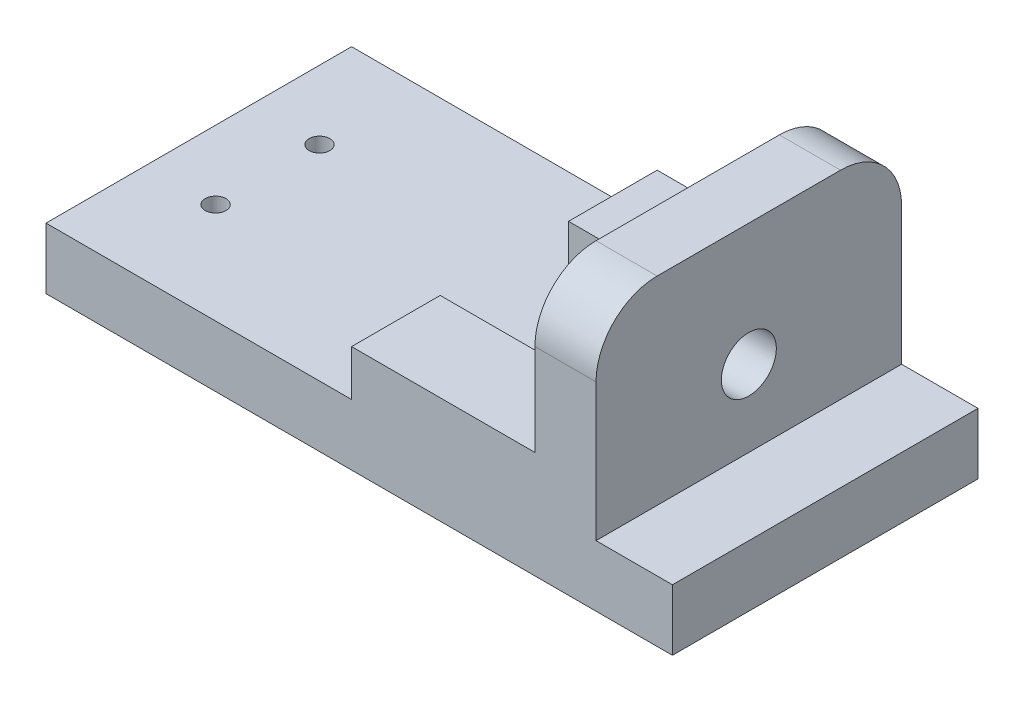
ISO-10303-21;
HEADER;
FILE_DESCRIPTION(('STEP AP214'),'2;1');
FILE_NAME('part.step','',(''),(''),'','','');
FILE_SCHEMA(('AUTOMOTIVE_DESIGN { 1 0 10303 214 1 1 1 1 }'));
ENDSEC;
DATA;
#1=APPLICATION_CONTEXT('core data for automotive mechanical design processes');
#2=APPLICATION_PROTOCOL_DEFINITION('international standard','automotive_design',2000,#1);
#3=PRODUCT_CONTEXT('',#1,'mechanical');
#4=PRODUCT('Part','Part','',(#3));
#5=PRODUCT_RELATED_PRODUCT_CATEGORY('part','',(#4));
#6=PRODUCT_DEFINITION_FORMATION('','',#4);
#7=PRODUCT_DEFINITION_CONTEXT('part definition',#1,'design');
#8=PRODUCT_DEFINITION('design','',#6,#7);
#9=PRODUCT_DEFINITION_SHAPE('','',#8);
#10=(LENGTH_UNIT() NAMED_UNIT(*) SI_UNIT(.MILLI.,.METRE.));
#11=(NAMED_UNIT(*) PLANE_ANGLE_UNIT() SI_UNIT($,.RADIAN.));
#12=(NAMED_UNIT(*) SI_UNIT($,.STERADIAN.) SOLID_ANGLE_UNIT());
#13=UNCERTAINTY_MEASURE_WITH_UNIT(LENGTH_MEASURE(1.E-05),#10,'distance_accuracy_value','');
#14=(GEOMETRIC_REPRESENTATION_CONTEXT(3) GLOBAL_UNCERTAINTY_ASSIGNED_CONTEXT((#13)) GLOBAL_UNIT_ASSIGNED_CONTEXT((#10,
#11,#12)) REPRESENTATION_CONTEXT('',''));
#15=CARTESIAN_POINT('',(0.,0.,0.));
#16=DIRECTION('',(0.,0.,1.));
#17=DIRECTION('',(1.,0.,0.));
#18=AXIS2_PLACEMENT_3D('',#15,#16,#17);
#19=CARTESIAN_POINT('',(0.,20.,0.));
#20=DIRECTION('',(0.,-1.,0.));
#21=DIRECTION('',(0.,0.,-1.));
#22=AXIS2_PLACEMENT_3D('',#19,#20,#21);
#23=PLANE('',#22);
#24=CARTESIAN_POINT('',(-80.,20.,17.));
#25=DIRECTION('',(0.,1.,0.));
#26=DIRECTION('',(0.,0.,1.));
#27=AXIS2_PLACEMENT_3D('',#24,#25,#26);
#28=CIRCLE('',#27,3.4);
#29=CARTESIAN_POINT('',(-80.,20.,20.4));
#30=VERTEX_POINT('',#29);
#31=EDGE_CURVE('E306',#30,#30,#28,.T.);
#32=ORIENTED_EDGE('',*,*,#31,.F.);
#33=EDGE_LOOP('',(#32));
#34=FACE_BOUND('',#33,.T.);
#35=CARTESIAN_POINT('',(-80.,20.,-17.));
#36=DIRECTION('',(0.,1.,0.));
#37=DIRECTION('',(0.,0.,1.));
#38=AXIS2_PLACEMENT_3D('',#35,#36,#37);
#39=CIRCLE('',#38,3.4);
#40=CARTESIAN_POINT('',(-80.,20.,-13.6));
#41=VERTEX_POINT('',#40);
#42=EDGE_CURVE('E314',#41,#41,#39,.T.);
#43=ORIENTED_EDGE('',*,*,#42,.F.);
#44=EDGE_LOOP('',(#43));
#45=FACE_BOUND('',#44,.T.);
#46=DIRECTION('',(0.,0.,1.));
#47=VECTOR('',#46,1.);
#48=CARTESIAN_POINT('',(57.4999999999999,20.,-50.));
#49=LINE('',#48,#47);
#50=CARTESIAN_POINT('',(57.4999999999999,20.,-21.));
#51=VERTEX_POINT('',#50);
#52=CARTESIAN_POINT('',(57.4999999999999,20.,21.));
#53=VERTEX_POINT('',#52);
#54=EDGE_CURVE('E177',#51,#53,#49,.T.);
#55=ORIENTED_EDGE('',*,*,#54,.F.);
#56=DIRECTION('',(1.,0.,0.));
#57=VECTOR('',#56,1.);
#58=CARTESIAN_POINT('',(57.5,20.,-21.));
#59=LINE('',#58,#57);
#60=CARTESIAN_POINT('',(-2.5,20.,-21.));
#61=VERTEX_POINT('',#60);
#62=EDGE_CURVE('E364',#61,#51,#59,.T.);
#63=ORIENTED_EDGE('',*,*,#62,.F.);
#64=DIRECTION('',(0.,0.,1.));
#65=VECTOR('',#64,1.);
#66=CARTESIAN_POINT('',(-2.5,20.,-50.));
#67=LINE('',#66,#65);
#68=CARTESIAN_POINT('',(-2.5,20.,-50.));
#69=VERTEX_POINT('',#68);
#70=EDGE_CURVE('E369',#69,#61,#67,.T.);
#71=ORIENTED_EDGE('',*,*,#70,.F.);
#72=DIRECTION('',(-1.,0.,0.));
#73=VECTOR('',#72,1.);
#74=CARTESIAN_POINT('',(-102.5,20.,-50.));
#75=LINE('',#74,#73);
#76=CARTESIAN_POINT('',(-102.5,20.,-50.));
#77=VERTEX_POINT('',#76);
#78=EDGE_CURVE('E298',#69,#77,#75,.T.);
#79=ORIENTED_EDGE('',*,*,#78,.T.);
#80=DIRECTION('',(0.,0.,1.));
#81=VECTOR('',#80,1.);
#82=CARTESIAN_POINT('',(-102.5,20.,50.));
#83=LINE('',#82,#81);
#84=CARTESIAN_POINT('',(-102.5,20.,50.));
#85=VERTEX_POINT('',#84);
#86=EDGE_CURVE('E185',#77,#85,#83,.T.);
#87=ORIENTED_EDGE('',*,*,#86,.T.);
#88=DIRECTION('',(1.,0.,0.));
#89=VECTOR('',#88,1.);
#90=CARTESIAN_POINT('',(-102.5,20.,50.));
#91=LINE('',#90,#89);
#92=CARTESIAN_POINT('',(-2.5,20.,50.));
#93=VERTEX_POINT('',#92);
#94=EDGE_CURVE('E184',#85,#93,#91,.T.);
#95=ORIENTED_EDGE('',*,*,#94,.T.);
#96=DIRECTION('',(0.,0.,1.));
#97=VECTOR('',#96,1.);
#98=CARTESIAN_POINT('',(-2.5,20.,50.));
#99=LINE('',#98,#97);
#100=CARTESIAN_POINT('',(-2.5,20.,21.));
#101=VERTEX_POINT('',#100);
#102=EDGE_CURVE('E331',#101,#93,#99,.T.);
#103=ORIENTED_EDGE('',*,*,#102,.F.);
#104=DIRECTION('',(-1.,0.,0.));
#105=VECTOR('',#104,1.);
#106=CARTESIAN_POINT('',(57.5,20.,21.));
#107=LINE('',#106,#105);
#108=EDGE_CURVE('E336',#53,#101,#107,.T.);
#109=ORIENTED_EDGE('',*,*,#108,.F.);
#110=EDGE_LOOP('',(#55,#63,#71,#79,#87,#95,#103,#109));
#111=FACE_BOUND('',#110,.T.);
#112=ADVANCED_FACE('F43',(#34,#45,#111),#23,.F.);
#113=DIRECTION('',(0.,0.,-1.));
#114=VECTOR('',#113,1.);
#115=CARTESIAN_POINT('',(77.5,20.,-50.));
#116=LINE('',#115,#114);
#117=CARTESIAN_POINT('',(77.5,20.,50.));
#118=VERTEX_POINT('',#117);
#119=CARTESIAN_POINT('',(77.5,20.,-50.));
#120=VERTEX_POINT('',#119);
#121=EDGE_CURVE('E161',#118,#120,#116,.T.);
#122=ORIENTED_EDGE('',*,*,#121,.F.);
#123=CARTESIAN_POINT('',(102.5,20.,50.));
#124=VERTEX_POINT('',#123);
#125=EDGE_CURVE('E172',#118,#124,#91,.T.);
#126=ORIENTED_EDGE('',*,*,#125,.T.);
#127=DIRECTION('',(0.,0.,-1.));
#128=VECTOR('',#127,1.);
#129=CARTESIAN_POINT('',(102.5,20.,50.));
#130=LINE('',#129,#128);
#131=CARTESIAN_POINT('',(102.5,20.,-50.));
#132=VERTEX_POINT('',#131);
#133=EDGE_CURVE('E206',#124,#132,#130,.T.);
#134=ORIENTED_EDGE('',*,*,#133,.T.);
#135=EDGE_CURVE('E174',#132,#120,#75,.T.);
#136=ORIENTED_EDGE('',*,*,#135,.T.);
#137=EDGE_LOOP('',(#122,#126,#134,#136));
#138=FACE_BOUND('',#137,.T.);
#139=ADVANCED_FACE('F170',(#138),#23,.F.);
#140=CARTESIAN_POINT('',(102.5,20.,50.));
#141=DIRECTION('',(-1.,0.,0.));
#142=DIRECTION('',(0.,0.,1.));
#143=AXIS2_PLACEMENT_3D('',#140,#141,#142);
#144=PLANE('',#143);
#145=DIRECTION('',(0.,0.,-1.));
#146=VECTOR('',#145,1.);
#147=CARTESIAN_POINT('',(102.5,0.,50.));
#148=LINE('',#147,#146);
#149=CARTESIAN_POINT('',(102.5,0.,50.));
#150=VERTEX_POINT('',#149);
#151=CARTESIAN_POINT('',(102.5,0.,-50.));
#152=VERTEX_POINT('',#151);
#153=EDGE_CURVE('E192',#150,#152,#148,.T.);
#154=ORIENTED_EDGE('',*,*,#153,.T.);
#155=DIRECTION('',(0.,-1.,0.));
#156=VECTOR('',#155,1.);
#157=CARTESIAN_POINT('',(102.5,20.,-50.));
#158=LINE('',#157,#156);
#159=EDGE_CURVE('E217',#132,#152,#158,.T.);
#160=ORIENTED_EDGE('',*,*,#159,.F.);
#161=ORIENTED_EDGE('',*,*,#133,.F.);
#162=DIRECTION('',(0.,-1.,0.));
#163=VECTOR('',#162,1.);
#164=CARTESIAN_POINT('',(102.5,20.,50.));
#165=LINE('',#164,#163);
#166=EDGE_CURVE('E181',#124,#150,#165,.T.);
#167=ORIENTED_EDGE('',*,*,#166,.T.);
#168=EDGE_LOOP('',(#154,#160,#161,#167));
#169=FACE_BOUND('',#168,.T.);
#170=ADVANCED_FACE('F267',(#169),#144,.F.);
#171=CARTESIAN_POINT('',(-102.5,20.,-50.));
#172=DIRECTION('',(0.,0.,1.));
#173=DIRECTION('',(1.,0.,0.));
#174=AXIS2_PLACEMENT_3D('',#171,#172,#173);
#175=PLANE('',#174);
#176=DIRECTION('',(0.,-1.,0.));
#177=VECTOR('',#176,1.);
#178=CARTESIAN_POINT('',(57.4999999999999,85.,-50.));
#179=LINE('',#178,#177);
#180=CARTESIAN_POINT('',(57.4999999999999,65.,-50.));
#181=VERTEX_POINT('',#180);
#182=CARTESIAN_POINT('',(57.5,35.,-50.));
#183=VERTEX_POINT('',#182);
#184=EDGE_CURVE('E390',#181,#183,#179,.T.);
#185=ORIENTED_EDGE('',*,*,#184,.F.);
#186=DIRECTION('',(-1.,0.,0.));
#187=VECTOR('',#186,1.);
#188=CARTESIAN_POINT('',(77.5,65.,-50.));
#189=LINE('',#188,#187);
#190=CARTESIAN_POINT('',(77.5,65.,-50.));
#191=VERTEX_POINT('',#190);
#192=EDGE_CURVE('E11',#181,#191,#189,.F.);
#193=ORIENTED_EDGE('',*,*,#192,.T.);
#194=DIRECTION('',(0.,-1.,0.));
#195=VECTOR('',#194,1.);
#196=CARTESIAN_POINT('',(77.5,85.,-50.));
#197=LINE('',#196,#195);
#198=EDGE_CURVE('E167',#191,#120,#197,.T.);
#199=ORIENTED_EDGE('',*,*,#198,.T.);
#200=ORIENTED_EDGE('',*,*,#135,.F.);
#201=ORIENTED_EDGE('',*,*,#159,.T.);
#202=DIRECTION('',(-1.,0.,0.));
#203=VECTOR('',#202,1.);
#204=CARTESIAN_POINT('',(-102.5,0.,-50.));
#205=LINE('',#204,#203);
#206=CARTESIAN_POINT('',(-102.5,0.,-50.));
#207=VERTEX_POINT('',#206);
#208=EDGE_CURVE('E196',#152,#207,#205,.T.);
#209=ORIENTED_EDGE('',*,*,#208,.T.);
#210=DIRECTION('',(0.,-1.,0.));
#211=VECTOR('',#210,1.);
#212=CARTESIAN_POINT('',(-102.5,20.,-50.));
#213=LINE('',#212,#211);
#214=EDGE_CURVE('E213',#77,#207,#213,.T.);
#215=ORIENTED_EDGE('',*,*,#214,.F.);
#216=ORIENTED_EDGE('',*,*,#78,.F.);
#217=DIRECTION('',(0.,-1.,0.));
#218=VECTOR('',#217,1.);
#219=CARTESIAN_POINT('',(-2.5,35.,-50.));
#220=LINE('',#219,#218);
#221=CARTESIAN_POINT('',(-2.5,35.,-50.));
#222=VERTEX_POINT('',#221);
#223=EDGE_CURVE('E340',#222,#69,#220,.T.);
#224=ORIENTED_EDGE('',*,*,#223,.F.);
#225=DIRECTION('',(-1.,0.,0.));
#226=VECTOR('',#225,1.);
#227=CARTESIAN_POINT('',(57.5,35.,-50.));
#228=LINE('',#227,#226);
#229=EDGE_CURVE('E368',#183,#222,#228,.T.);
#230=ORIENTED_EDGE('',*,*,#229,.F.);
#231=EDGE_LOOP('',(#185,#193,#199,#200,#201,#209,#215,#216,#224,#230));
#232=FACE_BOUND('',#231,.T.);
#233=ADVANCED_FACE('F283',(#232),#175,.F.);
#234=CARTESIAN_POINT('',(-102.5,20.,50.));
#235=DIRECTION('',(1.,0.,0.));
#236=DIRECTION('',(0.,0.,-1.));
#237=AXIS2_PLACEMENT_3D('',#234,#235,#236);
#238=PLANE('',#237);
#239=DIRECTION('',(0.,0.,1.));
#240=VECTOR('',#239,1.);
#241=CARTESIAN_POINT('',(-102.5,0.,50.));
#242=LINE('',#241,#240);
#243=CARTESIAN_POINT('',(-102.5,0.,50.));
#244=VERTEX_POINT('',#243);
#245=EDGE_CURVE('E200',#207,#244,#242,.T.);
#246=ORIENTED_EDGE('',*,*,#245,.T.);
#247=DIRECTION('',(0.,-1.,0.));
#248=VECTOR('',#247,1.);
#249=CARTESIAN_POINT('',(-102.5,20.,50.));
#250=LINE('',#249,#248);
#251=EDGE_CURVE('E209',#85,#244,#250,.T.);
#252=ORIENTED_EDGE('',*,*,#251,.F.);
#253=ORIENTED_EDGE('',*,*,#86,.F.);
#254=ORIENTED_EDGE('',*,*,#214,.T.);
#255=EDGE_LOOP('',(#246,#252,#253,#254));
#256=FACE_BOUND('',#255,.T.);
#257=ADVANCED_FACE('F280',(#256),#238,.F.);
#258=CARTESIAN_POINT('',(-102.5,20.,50.));
#259=DIRECTION('',(0.,0.,-1.));
#260=DIRECTION('',(-1.,0.,0.));
#261=AXIS2_PLACEMENT_3D('',#258,#259,#260);
#262=PLANE('',#261);
#263=DIRECTION('',(0.,-1.,0.));
#264=VECTOR('',#263,1.);
#265=CARTESIAN_POINT('',(77.5,85.,50.));
#266=LINE('',#265,#264);
#267=CARTESIAN_POINT('',(77.5,65.,50.));
#268=VERTEX_POINT('',#267);
#269=EDGE_CURVE('E156',#268,#118,#266,.T.);
#270=ORIENTED_EDGE('',*,*,#269,.F.);
#271=DIRECTION('',(1.,0.,0.));
#272=VECTOR('',#271,1.);
#273=CARTESIAN_POINT('',(57.4999999999999,65.,50.));
#274=LINE('',#273,#272);
#275=CARTESIAN_POINT('',(57.4999999999999,65.,50.));
#276=VERTEX_POINT('',#275);
#277=EDGE_CURVE('E67',#268,#276,#274,.F.);
#278=ORIENTED_EDGE('',*,*,#277,.T.);
#279=DIRECTION('',(0.,-1.,0.));
#280=VECTOR('',#279,1.);
#281=CARTESIAN_POINT('',(57.4999999999999,85.,50.));
#282=LINE('',#281,#280);
#283=CARTESIAN_POINT('',(57.4999999999999,35.,50.));
#284=VERTEX_POINT('',#283);
#285=EDGE_CURVE('E166',#276,#284,#282,.T.);
#286=ORIENTED_EDGE('',*,*,#285,.T.);
#287=DIRECTION('',(1.,0.,0.));
#288=VECTOR('',#287,1.);
#289=CARTESIAN_POINT('',(57.5,35.,50.));
#290=LINE('',#289,#288);
#291=CARTESIAN_POINT('',(-2.5,35.,50.));
#292=VERTEX_POINT('',#291);
#293=EDGE_CURVE('E330',#292,#284,#290,.T.);
#294=ORIENTED_EDGE('',*,*,#293,.F.);
#295=DIRECTION('',(0.,-1.,0.));
#296=VECTOR('',#295,1.);
#297=CARTESIAN_POINT('',(-2.5,35.,50.));
#298=LINE('',#297,#296);
#299=EDGE_CURVE('E326',#292,#93,#298,.T.);
#300=ORIENTED_EDGE('',*,*,#299,.T.);
#301=ORIENTED_EDGE('',*,*,#94,.F.);
#302=ORIENTED_EDGE('',*,*,#251,.T.);
#303=DIRECTION('',(1.,0.,0.));
#304=VECTOR('',#303,1.);
#305=CARTESIAN_POINT('',(-102.5,0.,50.));
#306=LINE('',#305,#304);
#307=EDGE_CURVE('E203',#244,#150,#306,.T.);
#308=ORIENTED_EDGE('',*,*,#307,.T.);
#309=ORIENTED_EDGE('',*,*,#166,.F.);
#310=ORIENTED_EDGE('',*,*,#125,.F.);
#311=EDGE_LOOP('',(#270,#278,#286,#294,#300,#301,#302,#308,#309,#310));
#312=FACE_BOUND('',#311,.T.);
#313=ADVANCED_FACE('F179',(#312),#262,.F.);
#314=CARTESIAN_POINT('',(0.,0.,0.));
#315=DIRECTION('',(0.,-1.,0.));
#316=DIRECTION('',(0.,0.,-1.));
#317=AXIS2_PLACEMENT_3D('',#314,#315,#316);
#318=PLANE('',#317);
#319=CARTESIAN_POINT('',(-80.,0.,-17.));
#320=DIRECTION('',(0.,1.,0.));
#321=DIRECTION('',(0.,0.,1.));
#322=AXIS2_PLACEMENT_3D('',#319,#320,#321);
#323=CIRCLE('',#322,3.4);
#324=CARTESIAN_POINT('',(-80.,0.,-13.6));
#325=VERTEX_POINT('',#324);
#326=EDGE_CURVE('E310',#325,#325,#323,.T.);
#327=ORIENTED_EDGE('',*,*,#326,.T.);
#328=EDGE_LOOP('',(#327));
#329=FACE_BOUND('',#328,.T.);
#330=CARTESIAN_POINT('',(-80.,0.,17.));
#331=DIRECTION('',(0.,1.,0.));
#332=DIRECTION('',(0.,0.,1.));
#333=AXIS2_PLACEMENT_3D('',#330,#331,#332);
#334=CIRCLE('',#333,3.4);
#335=CARTESIAN_POINT('',(-80.,0.,20.4));
#336=VERTEX_POINT('',#335);
#337=EDGE_CURVE('E197',#336,#336,#334,.T.);
#338=ORIENTED_EDGE('',*,*,#337,.T.);
#339=EDGE_LOOP('',(#338));
#340=FACE_BOUND('',#339,.T.);
#341=ORIENTED_EDGE('',*,*,#153,.F.);
#342=ORIENTED_EDGE('',*,*,#307,.F.);
#343=ORIENTED_EDGE('',*,*,#245,.F.);
#344=ORIENTED_EDGE('',*,*,#208,.F.);
#345=EDGE_LOOP('',(#341,#342,#343,#344));
#346=FACE_BOUND('',#345,.T.);
#347=ADVANCED_FACE('F274',(#329,#340,#346),#318,.T.);
#348=CARTESIAN_POINT('',(-80.,20.,17.));
#349=DIRECTION('',(0.,1.,0.));
#350=DIRECTION('',(0.,0.,1.));
#351=AXIS2_PLACEMENT_3D('',#348,#349,#350);
#352=CYLINDRICAL_SURFACE('',#351,3.4);
#353=ORIENTED_EDGE('',*,*,#337,.F.);
#354=EDGE_LOOP('',(#353));
#355=FACE_BOUND('',#354,.T.);
#356=ORIENTED_EDGE('',*,*,#31,.T.);
#357=EDGE_LOOP('',(#356));
#358=FACE_BOUND('',#357,.T.);
#359=ADVANCED_FACE('F272',(#355,#358),#352,.F.);
#360=CARTESIAN_POINT('',(-80.,20.,-17.));
#361=DIRECTION('',(0.,1.,0.));
#362=DIRECTION('',(0.,0.,1.));
#363=AXIS2_PLACEMENT_3D('',#360,#361,#362);
#364=CYLINDRICAL_SURFACE('',#363,3.4);
#365=ORIENTED_EDGE('',*,*,#326,.F.);
#366=EDGE_LOOP('',(#365));
#367=FACE_BOUND('',#366,.T.);
#368=ORIENTED_EDGE('',*,*,#42,.T.);
#369=EDGE_LOOP('',(#368));
#370=FACE_BOUND('',#369,.T.);
#371=ADVANCED_FACE('F438',(#367,#370),#364,.F.);
#372=CARTESIAN_POINT('',(57.5,35.,21.));
#373=DIRECTION('',(0.,0.,1.));
#374=DIRECTION('',(1.,0.,0.));
#375=AXIS2_PLACEMENT_3D('',#372,#373,#374);
#376=PLANE('',#375);
#377=ORIENTED_EDGE('',*,*,#108,.T.);
#378=DIRECTION('',(0.,-1.,0.));
#379=VECTOR('',#378,1.);
#380=CARTESIAN_POINT('',(-2.5,35.,21.));
#381=LINE('',#380,#379);
#382=CARTESIAN_POINT('',(-2.5,35.,21.));
#383=VERTEX_POINT('',#382);
#384=EDGE_CURVE('E322',#383,#101,#381,.T.);
#385=ORIENTED_EDGE('',*,*,#384,.F.);
#386=DIRECTION('',(-1.,0.,0.));
#387=VECTOR('',#386,1.);
#388=CARTESIAN_POINT('',(57.5,35.,21.));
#389=LINE('',#388,#387);
#390=CARTESIAN_POINT('',(57.4999999999999,35.,21.));
#391=VERTEX_POINT('',#390);
#392=EDGE_CURVE('E347',#391,#383,#389,.T.);
#393=ORIENTED_EDGE('',*,*,#392,.F.);
#394=DIRECTION('',(0.,-1.,0.));
#395=VECTOR('',#394,1.);
#396=CARTESIAN_POINT('',(57.5,35.,21.));
#397=LINE('',#396,#395);
#398=EDGE_CURVE('E318',#391,#53,#397,.T.);
#399=ORIENTED_EDGE('',*,*,#398,.T.);
#400=EDGE_LOOP('',(#377,#385,#393,#399));
#401=FACE_BOUND('',#400,.T.);
#402=ADVANCED_FACE('F435',(#401),#376,.F.);
#403=CARTESIAN_POINT('',(-2.5,35.,50.));
#404=DIRECTION('',(1.,0.,0.));
#405=DIRECTION('',(0.,0.,-1.));
#406=AXIS2_PLACEMENT_3D('',#403,#404,#405);
#407=PLANE('',#406);
#408=ORIENTED_EDGE('',*,*,#102,.T.);
#409=ORIENTED_EDGE('',*,*,#299,.F.);
#410=DIRECTION('',(0.,0.,1.));
#411=VECTOR('',#410,1.);
#412=CARTESIAN_POINT('',(-2.5,35.,50.));
#413=LINE('',#412,#411);
#414=EDGE_CURVE('E344',#383,#292,#413,.T.);
#415=ORIENTED_EDGE('',*,*,#414,.F.);
#416=ORIENTED_EDGE('',*,*,#384,.T.);
#417=EDGE_LOOP('',(#408,#409,#415,#416));
#418=FACE_BOUND('',#417,.T.);
#419=ADVANCED_FACE('F431',(#418),#407,.F.);
#420=CARTESIAN_POINT('',(0.,35.,0.));
#421=DIRECTION('',(0.,1.,0.));
#422=DIRECTION('',(0.,0.,1.));
#423=AXIS2_PLACEMENT_3D('',#420,#421,#422);
#424=PLANE('',#423);
#425=DIRECTION('',(0.,0.,-1.));
#426=VECTOR('',#425,1.);
#427=CARTESIAN_POINT('',(57.5,35.,50.));
#428=LINE('',#427,#426);
#429=EDGE_CURVE('E335',#284,#391,#428,.T.);
#430=ORIENTED_EDGE('',*,*,#429,.T.);
#431=ORIENTED_EDGE('',*,*,#392,.T.);
#432=ORIENTED_EDGE('',*,*,#414,.T.);
#433=ORIENTED_EDGE('',*,*,#293,.T.);
#434=EDGE_LOOP('',(#430,#431,#432,#433));
#435=FACE_BOUND('',#434,.T.);
#436=ADVANCED_FACE('F427',(#435),#424,.T.);
#437=CARTESIAN_POINT('',(-2.5,35.,-50.));
#438=DIRECTION('',(1.,0.,0.));
#439=DIRECTION('',(0.,0.,-1.));
#440=AXIS2_PLACEMENT_3D('',#437,#438,#439);
#441=PLANE('',#440);
#442=ORIENTED_EDGE('',*,*,#70,.T.);
#443=DIRECTION('',(0.,-1.,0.));
#444=VECTOR('',#443,1.);
#445=CARTESIAN_POINT('',(-2.5,35.,-21.));
#446=LINE('',#445,#444);
#447=CARTESIAN_POINT('',(-2.5,35.,-21.));
#448=VERTEX_POINT('',#447);
#449=EDGE_CURVE('E356',#448,#61,#446,.T.);
#450=ORIENTED_EDGE('',*,*,#449,.F.);
#451=DIRECTION('',(0.,0.,1.));
#452=VECTOR('',#451,1.);
#453=CARTESIAN_POINT('',(-2.5,35.,-50.));
#454=LINE('',#453,#452);
#455=EDGE_CURVE('E380',#222,#448,#454,.T.);
#456=ORIENTED_EDGE('',*,*,#455,.F.);
#457=ORIENTED_EDGE('',*,*,#223,.T.);
#458=EDGE_LOOP('',(#442,#450,#456,#457));
#459=FACE_BOUND('',#458,.T.);
#460=ADVANCED_FACE('F423',(#459),#441,.F.);
#461=CARTESIAN_POINT('',(57.5,35.,-21.));
#462=DIRECTION('',(0.,0.,-1.));
#463=DIRECTION('',(-1.,0.,0.));
#464=AXIS2_PLACEMENT_3D('',#461,#462,#463);
#465=PLANE('',#464);
#466=ORIENTED_EDGE('',*,*,#62,.T.);
#467=DIRECTION('',(0.,-1.,0.));
#468=VECTOR('',#467,1.);
#469=CARTESIAN_POINT('',(57.5,35.,-21.));
#470=LINE('',#469,#468);
#471=CARTESIAN_POINT('',(57.4999999999999,35.,-21.));
#472=VERTEX_POINT('',#471);
#473=EDGE_CURVE('E360',#472,#51,#470,.T.);
#474=ORIENTED_EDGE('',*,*,#473,.F.);
#475=DIRECTION('',(1.,0.,0.));
#476=VECTOR('',#475,1.);
#477=CARTESIAN_POINT('',(57.5,35.,-21.));
#478=LINE('',#477,#476);
#479=EDGE_CURVE('E376',#448,#472,#478,.T.);
#480=ORIENTED_EDGE('',*,*,#479,.F.);
#481=ORIENTED_EDGE('',*,*,#449,.T.);
#482=EDGE_LOOP('',(#466,#474,#480,#481));
#483=FACE_BOUND('',#482,.T.);
#484=ADVANCED_FACE('F417',(#483),#465,.F.);
#485=CARTESIAN_POINT('',(0.,35.,0.));
#486=DIRECTION('',(0.,1.,0.));
#487=DIRECTION('',(0.,0.,1.));
#488=AXIS2_PLACEMENT_3D('',#485,#486,#487);
#489=PLANE('',#488);
#490=ORIENTED_EDGE('',*,*,#229,.T.);
#491=ORIENTED_EDGE('',*,*,#455,.T.);
#492=ORIENTED_EDGE('',*,*,#479,.T.);
#493=DIRECTION('',(0.,0.,-1.));
#494=VECTOR('',#493,1.);
#495=CARTESIAN_POINT('',(57.5,35.,-50.));
#496=LINE('',#495,#494);
#497=EDGE_CURVE('E363',#472,#183,#496,.T.);
#498=ORIENTED_EDGE('',*,*,#497,.T.);
#499=EDGE_LOOP('',(#490,#491,#492,#498));
#500=FACE_BOUND('',#499,.T.);
#501=ADVANCED_FACE('F409',(#500),#489,.T.);
#502=CARTESIAN_POINT('',(57.4999999999999,85.,-50.));
#503=DIRECTION('',(1.,0.,0.));
#504=DIRECTION('',(0.,0.,-1.));
#505=AXIS2_PLACEMENT_3D('',#502,#503,#504);
#506=PLANE('',#505);
#507=CARTESIAN_POINT('',(57.4999999999999,45.,0.));
#508=DIRECTION('',(-1.,0.,0.));
#509=DIRECTION('',(0.,0.,1.));
#510=AXIS2_PLACEMENT_3D('',#507,#508,#509);
#511=CIRCLE('',#510,8.99999999999999);
#512=CARTESIAN_POINT('',(57.4999999999999,45.,8.99999999999999));
#513=VERTEX_POINT('',#512);
#514=EDGE_CURVE('E401',#513,#513,#511,.T.);
#515=ORIENTED_EDGE('',*,*,#514,.F.);
#516=EDGE_LOOP('',(#515));
#517=FACE_BOUND('',#516,.T.);
#518=ORIENTED_EDGE('',*,*,#285,.F.);
#519=CARTESIAN_POINT('',(57.4999999999999,65.,30.));
#520=DIRECTION('',(1.,0.,0.));
#521=DIRECTION('',(0.,0.,-1.));
#522=AXIS2_PLACEMENT_3D('',#519,#520,#521);
#523=CIRCLE('',#522,20.);
#524=CARTESIAN_POINT('',(57.4999999999999,85.,30.));
#525=VERTEX_POINT('',#524);
#526=EDGE_CURVE('E52',#276,#525,#523,.F.);
#527=ORIENTED_EDGE('',*,*,#526,.T.);
#528=DIRECTION('',(0.,0.,1.));
#529=VECTOR('',#528,1.);
#530=CARTESIAN_POINT('',(57.4999999999999,85.,-50.));
#531=LINE('',#530,#529);
#532=CARTESIAN_POINT('',(57.4999999999999,85.,-30.));
#533=VERTEX_POINT('',#532);
#534=EDGE_CURVE('E176',#533,#525,#531,.T.);
#535=ORIENTED_EDGE('',*,*,#534,.F.);
#536=CARTESIAN_POINT('',(57.4999999999999,65.,-30.));
#537=DIRECTION('',(1.,0.,0.));
#538=DIRECTION('',(0.,0.,-1.));
#539=AXIS2_PLACEMENT_3D('',#536,#537,#538);
#540=CIRCLE('',#539,20.);
#541=EDGE_CURVE('E59',#533,#181,#540,.F.);
#542=ORIENTED_EDGE('',*,*,#541,.T.);
#543=ORIENTED_EDGE('',*,*,#184,.T.);
#544=ORIENTED_EDGE('',*,*,#497,.F.);
#545=ORIENTED_EDGE('',*,*,#473,.T.);
#546=ORIENTED_EDGE('',*,*,#54,.T.);
#547=ORIENTED_EDGE('',*,*,#398,.F.);
#548=ORIENTED_EDGE('',*,*,#429,.F.);
#549=EDGE_LOOP('',(#518,#527,#535,#542,#543,#544,#545,#546,#547,#548));
#550=FACE_BOUND('',#549,.T.);
#551=ADVANCED_FACE('F240',(#517,#550),#506,.F.);
#552=CARTESIAN_POINT('',(77.5,85.,-50.));
#553=DIRECTION('',(-1.,0.,0.));
#554=DIRECTION('',(0.,0.,1.));
#555=AXIS2_PLACEMENT_3D('',#552,#553,#554);
#556=PLANE('',#555);
#557=CARTESIAN_POINT('',(77.5,45.,0.));
#558=DIRECTION('',(-1.,0.,0.));
#559=DIRECTION('',(0.,0.,1.));
#560=AXIS2_PLACEMENT_3D('',#557,#558,#559);
#561=CIRCLE('',#560,8.99999999999999);
#562=CARTESIAN_POINT('',(77.5,45.,8.99999999999999));
#563=VERTEX_POINT('',#562);
#564=EDGE_CURVE('E395',#563,#563,#561,.T.);
#565=ORIENTED_EDGE('',*,*,#564,.T.);
#566=EDGE_LOOP('',(#565));
#567=FACE_BOUND('',#566,.T.);
#568=DIRECTION('',(0.,0.,-1.));
#569=VECTOR('',#568,1.);
#570=CARTESIAN_POINT('',(77.5,85.,-50.));
#571=LINE('',#570,#569);
#572=CARTESIAN_POINT('',(77.5,85.,30.));
#573=VERTEX_POINT('',#572);
#574=CARTESIAN_POINT('',(77.5,85.,-30.));
#575=VERTEX_POINT('',#574);
#576=EDGE_CURVE('E249',#573,#575,#571,.T.);
#577=ORIENTED_EDGE('',*,*,#576,.F.);
#578=CARTESIAN_POINT('',(77.5,65.,30.));
#579=DIRECTION('',(-1.,0.,0.));
#580=DIRECTION('',(0.,0.,1.));
#581=AXIS2_PLACEMENT_3D('',#578,#579,#580);
#582=CIRCLE('',#581,20.);
#583=EDGE_CURVE('E163',#573,#268,#582,.F.);
#584=ORIENTED_EDGE('',*,*,#583,.T.);
#585=ORIENTED_EDGE('',*,*,#269,.T.);
#586=ORIENTED_EDGE('',*,*,#121,.T.);
#587=ORIENTED_EDGE('',*,*,#198,.F.);
#588=CARTESIAN_POINT('',(77.5,65.,-30.));
#589=DIRECTION('',(-1.,0.,0.));
#590=DIRECTION('',(0.,0.,1.));
#591=AXIS2_PLACEMENT_3D('',#588,#589,#590);
#592=CIRCLE('',#591,20.);
#593=EDGE_CURVE('E229',#191,#575,#592,.F.);
#594=ORIENTED_EDGE('',*,*,#593,.T.);
#595=EDGE_LOOP('',(#577,#584,#585,#586,#587,#594));
#596=FACE_BOUND('',#595,.T.);
#597=ADVANCED_FACE('F159',(#567,#596),#556,.F.);
#598=CARTESIAN_POINT('',(0.,85.,0.));
#599=DIRECTION('',(0.,1.,0.));
#600=DIRECTION('',(0.,0.,1.));
#601=AXIS2_PLACEMENT_3D('',#598,#599,#600);
#602=PLANE('',#601);
#603=ORIENTED_EDGE('',*,*,#534,.T.);
#604=DIRECTION('',(1.,0.,0.));
#605=VECTOR('',#604,1.);
#606=CARTESIAN_POINT('',(77.5,85.,30.));
#607=LINE('',#606,#605);
#608=EDGE_CURVE('E225',#525,#573,#607,.T.);
#609=ORIENTED_EDGE('',*,*,#608,.T.);
#610=ORIENTED_EDGE('',*,*,#576,.T.);
#611=DIRECTION('',(-1.,0.,0.));
#612=VECTOR('',#611,1.);
#613=CARTESIAN_POINT('',(57.4999999999999,85.,-30.));
#614=LINE('',#613,#612);
#615=EDGE_CURVE('E221',#575,#533,#614,.T.);
#616=ORIENTED_EDGE('',*,*,#615,.T.);
#617=EDGE_LOOP('',(#603,#609,#610,#616));
#618=FACE_BOUND('',#617,.T.);
#619=ADVANCED_FACE('F245',(#618),#602,.T.);
#620=CARTESIAN_POINT('',(0.,65.,30.));
#621=DIRECTION('',(-1.,0.,0.));
#622=DIRECTION('',(0.,0.,1.));
#623=AXIS2_PLACEMENT_3D('',#620,#621,#622);
#624=CYLINDRICAL_SURFACE('',#623,20.);
#625=ORIENTED_EDGE('',*,*,#526,.F.);
#626=ORIENTED_EDGE('',*,*,#277,.F.);
#627=ORIENTED_EDGE('',*,*,#583,.F.);
#628=ORIENTED_EDGE('',*,*,#608,.F.);
#629=EDGE_LOOP('',(#625,#626,#627,#628));
#630=FACE_BOUND('',#629,.T.);
#631=ADVANCED_FACE('F251',(#630),#624,.T.);
#632=CARTESIAN_POINT('',(0.,65.,-30.));
#633=DIRECTION('',(1.,0.,0.));
#634=DIRECTION('',(0.,0.,-1.));
#635=AXIS2_PLACEMENT_3D('',#632,#633,#634);
#636=CYLINDRICAL_SURFACE('',#635,20.);
#637=ORIENTED_EDGE('',*,*,#593,.F.);
#638=ORIENTED_EDGE('',*,*,#192,.F.);
#639=ORIENTED_EDGE('',*,*,#541,.F.);
#640=ORIENTED_EDGE('',*,*,#615,.F.);
#641=EDGE_LOOP('',(#637,#638,#639,#640));
#642=FACE_BOUND('',#641,.T.);
#643=ADVANCED_FACE('F45',(#642),#636,.T.);
#644=CARTESIAN_POINT('',(57.4999999999999,45.,0.));
#645=DIRECTION('',(-1.,0.,0.));
#646=DIRECTION('',(0.,0.,1.));
#647=AXIS2_PLACEMENT_3D('',#644,#645,#646);
#648=CYLINDRICAL_SURFACE('',#647,8.99999999999999);
#649=ORIENTED_EDGE('',*,*,#514,.T.);
#650=EDGE_LOOP('',(#649));
#651=FACE_BOUND('',#650,.T.);
#652=ORIENTED_EDGE('',*,*,#564,.F.);
#653=EDGE_LOOP('',(#652));
#654=FACE_BOUND('',#653,.T.);
#655=ADVANCED_FACE('F257',(#651,#654),#648,.F.);
#656=CLOSED_SHELL('',(#112,#139,#170,#233,#257,#313,#347,#359,#371,#402,#419,#436,#460,#484,
#501,#551,#597,#619,#631,#643,#655));
#657=MANIFOLD_SOLID_BREP('B2',#656);
#658=ADVANCED_BREP_SHAPE_REPRESENTATION('',(#18,#657),#14);
#659=SHAPE_DEFINITION_REPRESENTATION(#9,#658);
ENDSEC;
END-ISO-10303-21;
